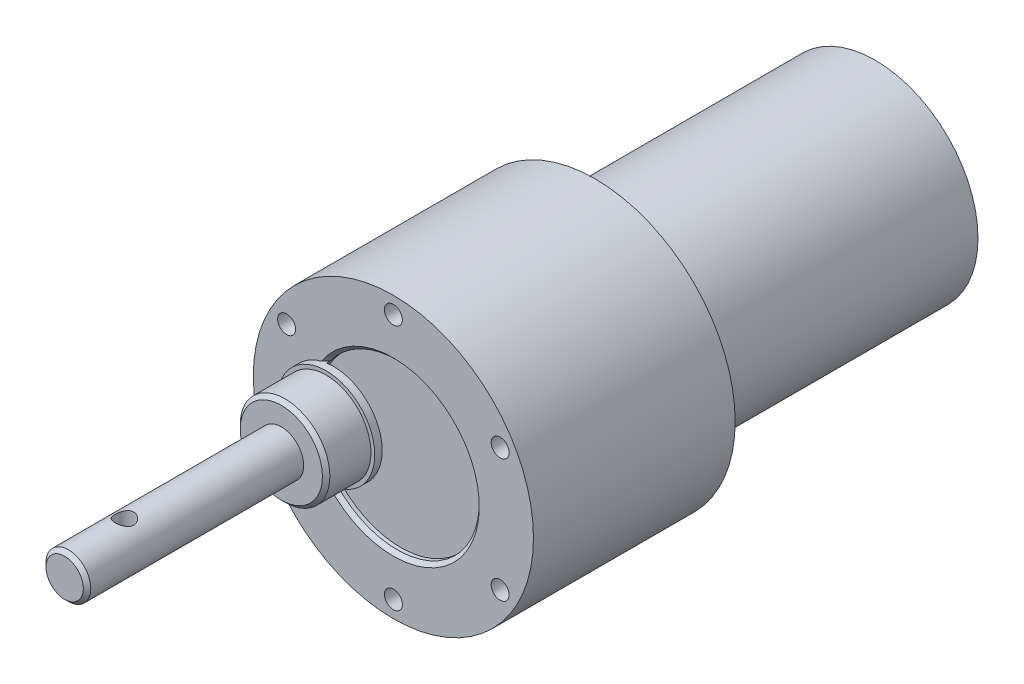
ISO-10303-21;
HEADER;
FILE_DESCRIPTION(('STEP AP214'),'2;1');
FILE_NAME('part.step','',(''),(''),'','','');
FILE_SCHEMA(('AUTOMOTIVE_DESIGN { 1 0 10303 214 1 1 1 1 }'));
ENDSEC;
DATA;
#1=APPLICATION_CONTEXT('core data for automotive mechanical design processes');
#2=APPLICATION_PROTOCOL_DEFINITION('international standard','automotive_design',2000,#1);
#3=PRODUCT_CONTEXT('',#1,'mechanical');
#4=PRODUCT('Part','Part','',(#3));
#5=PRODUCT_RELATED_PRODUCT_CATEGORY('part','',(#4));
#6=PRODUCT_DEFINITION_FORMATION('','',#4);
#7=PRODUCT_DEFINITION_CONTEXT('part definition',#1,'design');
#8=PRODUCT_DEFINITION('design','',#6,#7);
#9=PRODUCT_DEFINITION_SHAPE('','',#8);
#10=(LENGTH_UNIT() NAMED_UNIT(*) SI_UNIT(.MILLI.,.METRE.));
#11=(NAMED_UNIT(*) PLANE_ANGLE_UNIT() SI_UNIT($,.RADIAN.));
#12=(NAMED_UNIT(*) SI_UNIT($,.STERADIAN.) SOLID_ANGLE_UNIT());
#13=UNCERTAINTY_MEASURE_WITH_UNIT(LENGTH_MEASURE(1.E-05),#10,'distance_accuracy_value','');
#14=(GEOMETRIC_REPRESENTATION_CONTEXT(3) GLOBAL_UNCERTAINTY_ASSIGNED_CONTEXT((#13)) GLOBAL_UNIT_ASSIGNED_CONTEXT((#10,
#11,#12)) REPRESENTATION_CONTEXT('',''));
#15=CARTESIAN_POINT('',(0.,0.,0.));
#16=DIRECTION('',(0.,0.,1.));
#17=DIRECTION('',(1.,0.,0.));
#18=AXIS2_PLACEMENT_3D('',#15,#16,#17);
#19=CARTESIAN_POINT('',(0.,0.,64.5));
#20=DIRECTION('',(0.,0.,1.));
#21=DIRECTION('',(1.,0.,0.));
#22=AXIS2_PLACEMENT_3D('',#19,#20,#21);
#23=PLANE('',#22);
#24=CARTESIAN_POINT('',(0.,16.5,64.5));
#25=DIRECTION('',(0.,0.,1.));
#26=DIRECTION('',(1.,0.,0.));
#27=AXIS2_PLACEMENT_3D('',#24,#25,#26);
#28=CIRCLE('',#27,1.19999999999999);
#29=CARTESIAN_POINT('',(1.19999999999999,16.5,64.5));
#30=VERTEX_POINT('',#29);
#31=EDGE_CURVE('E215',#30,#30,#28,.T.);
#32=ORIENTED_EDGE('',*,*,#31,.F.);
#33=EDGE_LOOP('',(#32));
#34=FACE_BOUND('',#33,.T.);
#35=CARTESIAN_POINT('',(-14.28941916244,8.25,64.5));
#36=DIRECTION('',(0.,0.,1.));
#37=DIRECTION('',(1.,0.,0.));
#38=AXIS2_PLACEMENT_3D('',#35,#36,#37);
#39=CIRCLE('',#38,1.19999999999999);
#40=CARTESIAN_POINT('',(-13.08941916244,8.25,64.5));
#41=VERTEX_POINT('',#40);
#42=EDGE_CURVE('E676',#41,#41,#39,.T.);
#43=ORIENTED_EDGE('',*,*,#42,.F.);
#44=EDGE_LOOP('',(#43));
#45=FACE_BOUND('',#44,.T.);
#46=CARTESIAN_POINT('',(-14.28941916244,-8.25,64.5));
#47=DIRECTION('',(0.,0.,1.));
#48=DIRECTION('',(1.,0.,0.));
#49=AXIS2_PLACEMENT_3D('',#46,#47,#48);
#50=CIRCLE('',#49,1.19999999999999);
#51=CARTESIAN_POINT('',(-13.08941916244,-8.25,64.5));
#52=VERTEX_POINT('',#51);
#53=EDGE_CURVE('E670',#52,#52,#50,.T.);
#54=ORIENTED_EDGE('',*,*,#53,.F.);
#55=EDGE_LOOP('',(#54));
#56=FACE_BOUND('',#55,.T.);
#57=CARTESIAN_POINT('',(0.,-16.5,64.5));
#58=DIRECTION('',(0.,0.,1.));
#59=DIRECTION('',(1.,0.,0.));
#60=AXIS2_PLACEMENT_3D('',#57,#58,#59);
#61=CIRCLE('',#60,1.19999999999999);
#62=CARTESIAN_POINT('',(1.19999999999999,-16.5,64.5));
#63=VERTEX_POINT('',#62);
#64=EDGE_CURVE('E664',#63,#63,#61,.T.);
#65=ORIENTED_EDGE('',*,*,#64,.F.);
#66=EDGE_LOOP('',(#65));
#67=FACE_BOUND('',#66,.T.);
#68=CARTESIAN_POINT('',(14.28941916244,-8.25,64.5));
#69=DIRECTION('',(0.,0.,1.));
#70=DIRECTION('',(1.,0.,0.));
#71=AXIS2_PLACEMENT_3D('',#68,#69,#70);
#72=CIRCLE('',#71,1.19999999999999);
#73=CARTESIAN_POINT('',(15.48941916244,-8.25,64.5));
#74=VERTEX_POINT('',#73);
#75=EDGE_CURVE('E658',#74,#74,#72,.T.);
#76=ORIENTED_EDGE('',*,*,#75,.F.);
#77=EDGE_LOOP('',(#76));
#78=FACE_BOUND('',#77,.T.);
#79=CARTESIAN_POINT('',(14.28941916244,8.25,64.5));
#80=DIRECTION('',(0.,0.,1.));
#81=DIRECTION('',(1.,0.,0.));
#82=AXIS2_PLACEMENT_3D('',#79,#80,#81);
#83=CIRCLE('',#82,1.19999999999999);
#84=CARTESIAN_POINT('',(15.48941916244,8.25,64.5));
#85=VERTEX_POINT('',#84);
#86=EDGE_CURVE('E652',#85,#85,#83,.T.);
#87=ORIENTED_EDGE('',*,*,#86,.F.);
#88=EDGE_LOOP('',(#87));
#89=FACE_BOUND('',#88,.T.);
#90=CARTESIAN_POINT('',(-8.,0.,64.5));
#91=DIRECTION('',(0.,0.,1.));
#92=DIRECTION('',(1.,0.,0.));
#93=AXIS2_PLACEMENT_3D('',#90,#91,#92);
#94=CIRCLE('',#93,6.5);
#95=CARTESIAN_POINT('',(-9.62499999999996,6.29359793758706,64.5));
#96=VERTEX_POINT('',#95);
#97=CARTESIAN_POINT('',(-9.62499999999998,-6.29359793758706,64.5));
#98=VERTEX_POINT('',#97);
#99=EDGE_CURVE('E67',#96,#98,#94,.T.);
#100=ORIENTED_EDGE('',*,*,#99,.F.);
#101=CARTESIAN_POINT('',(0.,0.,64.5));
#102=DIRECTION('',(0.,0.,1.));
#103=DIRECTION('',(1.,0.,0.));
#104=AXIS2_PLACEMENT_3D('',#101,#102,#103);
#105=CIRCLE('',#104,11.4999999999999);
#106=EDGE_CURVE('E113',#96,#98,#105,.F.);
#107=ORIENTED_EDGE('',*,*,#106,.T.);
#108=EDGE_LOOP('',(#100,#107));
#109=FACE_BOUND('',#108,.T.);
#110=CARTESIAN_POINT('',(0.,0.,64.5));
#111=DIRECTION('',(0.,0.,1.));
#112=DIRECTION('',(1.,0.,0.));
#113=AXIS2_PLACEMENT_3D('',#110,#111,#112);
#114=CIRCLE('',#113,18.75);
#115=CARTESIAN_POINT('',(18.75,0.,64.5));
#116=VERTEX_POINT('',#115);
#117=EDGE_CURVE('E483',#116,#116,#114,.F.);
#118=ORIENTED_EDGE('',*,*,#117,.F.);
#119=EDGE_LOOP('',(#118));
#120=FACE_BOUND('',#119,.T.);
#121=ADVANCED_FACE('F47',(#34,#45,#56,#67,#78,#89,#109,#120),#23,.T.);
#122=CARTESIAN_POINT('',(0.,0.,63.5));
#123=DIRECTION('',(0.,0.,1.));
#124=DIRECTION('',(1.,0.,0.));
#125=AXIS2_PLACEMENT_3D('',#122,#123,#124);
#126=CYLINDRICAL_SURFACE('',#125,11.);
#127=CARTESIAN_POINT('',(0.,0.,63.5));
#128=DIRECTION('',(0.,0.,1.));
#129=DIRECTION('',(-1.,0.,0.));
#130=AXIS2_PLACEMENT_3D('',#127,#128,#129);
#131=CIRCLE('',#130,11.);
#132=CARTESIAN_POINT('',(-11.,0.,63.5));
#133=VERTEX_POINT('',#132);
#134=EDGE_CURVE('E87',#133,#133,#131,.T.);
#135=ORIENTED_EDGE('',*,*,#134,.F.);
#136=EDGE_LOOP('',(#135));
#137=FACE_BOUND('',#136,.T.);
#138=DIRECTION('',(0.,0.,1.));
#139=VECTOR('',#138,1.);
#140=CARTESIAN_POINT('',(-8.92187500000006,6.43429455996342,64.5));
#141=LINE('',#140,#139);
#142=CARTESIAN_POINT('',(-8.921875,6.43429455996343,64.5));
#143=VERTEX_POINT('',#142);
#144=CARTESIAN_POINT('',(-8.92187500000005,6.43429455996342,64.));
#145=VERTEX_POINT('',#144);
#146=EDGE_CURVE('E91',#143,#145,#141,.F.);
#147=ORIENTED_EDGE('',*,*,#146,.F.);
#148=CARTESIAN_POINT('',(0.,0.,64.5));
#149=DIRECTION('',(0.,0.,1.));
#150=DIRECTION('',(-1.,0.,0.));
#151=AXIS2_PLACEMENT_3D('',#148,#149,#150);
#152=CIRCLE('',#151,11.);
#153=CARTESIAN_POINT('',(-8.921875,-6.43429455996343,64.5));
#154=VERTEX_POINT('',#153);
#155=EDGE_CURVE('E80',#143,#154,#152,.T.);
#156=ORIENTED_EDGE('',*,*,#155,.T.);
#157=DIRECTION('',(0.,0.,1.));
#158=VECTOR('',#157,1.);
#159=CARTESIAN_POINT('',(-8.92187500000006,-6.43429455996342,64.5));
#160=LINE('',#159,#158);
#161=CARTESIAN_POINT('',(-8.921875,-6.43429455996343,63.9999999999999));
#162=VERTEX_POINT('',#161);
#163=EDGE_CURVE('E93',#162,#154,#160,.T.);
#164=ORIENTED_EDGE('',*,*,#163,.F.);
#165=CARTESIAN_POINT('',(0.,0.,64.));
#166=DIRECTION('',(0.,0.,1.));
#167=DIRECTION('',(0.,-1.,0.));
#168=AXIS2_PLACEMENT_3D('',#165,#166,#167);
#169=CIRCLE('',#168,11.);
#170=EDGE_CURVE('E99',#162,#145,#169,.T.);
#171=ORIENTED_EDGE('',*,*,#170,.T.);
#172=EDGE_LOOP('',(#147,#156,#164,#171));
#173=FACE_BOUND('',#172,.T.);
#174=ADVANCED_FACE('F98',(#137,#173),#126,.F.);
#175=CARTESIAN_POINT('',(0.,0.,37.5));
#176=DIRECTION('',(0.,0.,1.));
#177=DIRECTION('',(1.,0.,0.));
#178=AXIS2_PLACEMENT_3D('',#175,#176,#177);
#179=CYLINDRICAL_SURFACE('',#178,18.75);
#180=ORIENTED_EDGE('',*,*,#117,.T.);
#181=EDGE_LOOP('',(#180));
#182=FACE_BOUND('',#181,.T.);
#183=CARTESIAN_POINT('',(0.,0.,37.5));
#184=DIRECTION('',(0.,0.,1.));
#185=DIRECTION('',(1.,0.,0.));
#186=AXIS2_PLACEMENT_3D('',#183,#184,#185);
#187=CIRCLE('',#186,18.75);
#188=CARTESIAN_POINT('',(18.75,0.,37.5));
#189=VERTEX_POINT('',#188);
#190=EDGE_CURVE('E479',#189,#189,#187,.T.);
#191=ORIENTED_EDGE('',*,*,#190,.T.);
#192=EDGE_LOOP('',(#191));
#193=FACE_BOUND('',#192,.T.);
#194=ADVANCED_FACE('F145',(#182,#193),#179,.T.);
#195=CARTESIAN_POINT('',(0.,0.,37.5));
#196=DIRECTION('',(0.,0.,1.));
#197=DIRECTION('',(1.,0.,0.));
#198=AXIS2_PLACEMENT_3D('',#195,#196,#197);
#199=PLANE('',#198);
#200=CARTESIAN_POINT('',(0.,0.,37.5));
#201=DIRECTION('',(0.,0.,1.));
#202=DIRECTION('',(1.,0.,0.));
#203=AXIS2_PLACEMENT_3D('',#200,#201,#202);
#204=CIRCLE('',#203,13.75);
#205=CARTESIAN_POINT('',(13.75,0.,37.5));
#206=VERTEX_POINT('',#205);
#207=EDGE_CURVE('E181',#206,#206,#204,.F.);
#208=ORIENTED_EDGE('',*,*,#207,.F.);
#209=EDGE_LOOP('',(#208));
#210=FACE_BOUND('',#209,.T.);
#211=ORIENTED_EDGE('',*,*,#190,.F.);
#212=EDGE_LOOP('',(#211));
#213=FACE_BOUND('',#212,.T.);
#214=ADVANCED_FACE('F143',(#210,#213),#199,.F.);
#215=CARTESIAN_POINT('',(0.,0.,63.5));
#216=DIRECTION('',(0.,0.,-1.));
#217=DIRECTION('',(-1.,0.,0.));
#218=AXIS2_PLACEMENT_3D('',#215,#216,#217);
#219=PLANE('',#218);
#220=ORIENTED_EDGE('',*,*,#134,.T.);
#221=EDGE_LOOP('',(#220));
#222=FACE_BOUND('',#221,.T.);
#223=ADVANCED_FACE('F134',(#222),#219,.F.);
#224=CARTESIAN_POINT('',(-8.,0.,64.5));
#225=DIRECTION('',(0.,0.,1.));
#226=DIRECTION('',(1.,0.,0.));
#227=AXIS2_PLACEMENT_3D('',#224,#225,#226);
#228=CYLINDRICAL_SURFACE('',#227,6.5);
#229=CARTESIAN_POINT('',(-8.92187500000006,6.43429455996342,64.));
#230=CARTESIAN_POINT('',(-8.95164049411842,6.43002990789093,64.0216476348459));
#231=CARTESIAN_POINT('',(-8.98141654936967,6.42555294531898,64.0432389827954));
#232=CARTESIAN_POINT('',(-9.04084243522193,6.41619415622504,64.0862046482592));
#233=CARTESIAN_POINT('',(-9.07049219209192,6.41131435802628,64.1075795096235));
#234=CARTESIAN_POINT('',(-9.12966018917587,6.40115337928862,64.150112206616));
#235=CARTESIAN_POINT('',(-9.15917838245963,6.39587422332694,64.171270591086));
#236=CARTESIAN_POINT('',(-9.21807802090562,6.38491808439929,64.2133703266013));
#237=CARTESIAN_POINT('',(-9.24745944590181,6.37924312174978,64.2343122315675));
#238=CARTESIAN_POINT('',(-9.30608040637878,6.3674989813667,64.2759790038813));
#239=CARTESIAN_POINT('',(-9.33531994827563,6.36143181924831,64.2967044302395));
#240=CARTESIAN_POINT('',(-9.39365208205739,6.34890695193217,64.337938239308));
#241=CARTESIAN_POINT('',(-9.42274470679677,6.34245125718407,64.3584471861535));
#242=CARTESIAN_POINT('',(-9.48077803639548,6.32915304930846,64.3992480338503));
#243=CARTESIAN_POINT('',(-9.50971880035185,6.32231254102913,64.4195405039685));
#244=CARTESIAN_POINT('',(-9.56744350175877,6.30824849903447,64.4599083828936));
#245=CARTESIAN_POINT('',(-9.59622752447878,6.30102696404836,64.4799843661846));
#246=CARTESIAN_POINT('',(-9.62500000000001,6.29359793758705,64.5));
#247=B_SPLINE_CURVE_WITH_KNOTS('',3,(#229,#230,#231,#232,#233,#234,#235,#236,#237,#238,#239,
#240,#241,#242,#243,#244,#245,#246),.UNSPECIFIED.,.F.,.F.,(4,2,2,2,2,2,2,2,4),(0.,
0.111153021055083,0.221777019902357,0.331873600633093,0.441444390502537,0.550491040304504,
0.659015224751488,0.767018642860324,0.874503018343399),.UNSPECIFIED.);
#248=EDGE_CURVE('E117',#145,#96,#247,.T.);
#249=ORIENTED_EDGE('',*,*,#248,.T.);
#250=ORIENTED_EDGE('',*,*,#99,.T.);
#251=CARTESIAN_POINT('',(-9.62500000000001,-6.29359793758705,64.5));
#252=CARTESIAN_POINT('',(-9.59622752451259,-6.30102696403963,64.4799843662095));
#253=CARTESIAN_POINT('',(-9.56744350182662,-6.30824849901744,64.4599083829433));
#254=CARTESIAN_POINT('',(-9.50971880047823,-6.32231254099883,64.4195405040608));
#255=CARTESIAN_POINT('',(-9.48077803654635,-6.32915304927304,64.3992480339602));
#256=CARTESIAN_POINT('',(-9.422744706987,-6.34245125714133,64.3584471862917));
#257=CARTESIAN_POINT('',(-9.39365208226249,-6.34890695188708,64.3379382394569));
#258=CARTESIAN_POINT('',(-9.33531994850071,-6.36143181920104,64.2967044304026));
#259=CARTESIAN_POINT('',(-9.30608040660899,-6.36749898131946,64.2759790040479));
#260=CARTESIAN_POINT('',(-9.24745944613246,-6.3792431217047,64.2343122317341));
#261=CARTESIAN_POINT('',(-9.21807802113157,-6.38491808435621,64.2133703267643));
#262=CARTESIAN_POINT('',(-9.15917838266629,-6.39587422328955,64.1712705912349));
#263=CARTESIAN_POINT('',(-9.12966018936795,-6.40115337925479,64.1501122067542));
#264=CARTESIAN_POINT('',(-9.07049219224485,-6.41131435800086,64.1075795097334));
#265=CARTESIAN_POINT('',(-9.04084243535031,-6.41619415620433,64.0862046483513));
#266=CARTESIAN_POINT('',(-8.98141654943892,-6.42555294530857,64.0432389828449));
#267=CARTESIAN_POINT('',(-8.95164049415309,-6.43002990788596,64.0216476348707));
#268=CARTESIAN_POINT('',(-8.92187500000006,-6.43429455996342,64.));
#269=B_SPLINE_CURVE_WITH_KNOTS('',3,(#251,#252,#253,#254,#255,#256,#257,#258,#259,#260,#261,
#262,#263,#264,#265,#266,#267,#268),.UNSPECIFIED.,.F.,.F.,(4,2,2,2,2,2,2,2,4),(0.,
0.107484375354398,0.215487793371317,0.324011977763142,0.433058627546721,0.54262941743455,
0.652725998220455,0.763349997159663,0.874503018343449),.UNSPECIFIED.);
#270=EDGE_CURVE('E62',#98,#162,#269,.T.);
#271=ORIENTED_EDGE('',*,*,#270,.T.);
#272=ORIENTED_EDGE('',*,*,#163,.T.);
#273=EDGE_CURVE('E83',#154,#143,#94,.T.);
#274=ORIENTED_EDGE('',*,*,#273,.T.);
#275=ORIENTED_EDGE('',*,*,#146,.T.);
#276=EDGE_LOOP('',(#249,#250,#271,#272,#274,#275));
#277=FACE_BOUND('',#276,.T.);
#278=CARTESIAN_POINT('',(-8.,0.,65.5));
#279=DIRECTION('',(0.,0.,1.));
#280=DIRECTION('',(1.,0.,0.));
#281=AXIS2_PLACEMENT_3D('',#278,#279,#280);
#282=CIRCLE('',#281,6.5);
#283=CARTESIAN_POINT('',(-1.5,0.,65.5));
#284=VERTEX_POINT('',#283);
#285=EDGE_CURVE('E94',#284,#284,#282,.T.);
#286=ORIENTED_EDGE('',*,*,#285,.F.);
#287=EDGE_LOOP('',(#286));
#288=FACE_BOUND('',#287,.T.);
#289=ADVANCED_FACE('F89',(#277,#288),#228,.T.);
#290=CARTESIAN_POINT('',(0.,0.,64.5));
#291=DIRECTION('',(0.,0.,1.));
#292=DIRECTION('',(1.,0.,0.));
#293=AXIS2_PLACEMENT_3D('',#290,#291,#292);
#294=CONICAL_SURFACE('',#293,11.4999999999999,0.785398163397303);
#295=ORIENTED_EDGE('',*,*,#106,.F.);
#296=ORIENTED_EDGE('',*,*,#248,.F.);
#297=ORIENTED_EDGE('',*,*,#170,.F.);
#298=ORIENTED_EDGE('',*,*,#270,.F.);
#299=EDGE_LOOP('',(#295,#296,#297,#298));
#300=FACE_BOUND('',#299,.T.);
#301=ADVANCED_FACE('F133',(#300),#294,.F.);
#302=CARTESIAN_POINT('',(-8.,0.,65.5));
#303=DIRECTION('',(0.,0.,1.));
#304=DIRECTION('',(1.,0.,0.));
#305=AXIS2_PLACEMENT_3D('',#302,#303,#304);
#306=PLANE('',#305);
#307=CARTESIAN_POINT('',(-8.,0.,65.5));
#308=DIRECTION('',(0.,0.,1.));
#309=DIRECTION('',(1.,0.,0.));
#310=AXIS2_PLACEMENT_3D('',#307,#308,#309);
#311=CIRCLE('',#310,6.);
#312=CARTESIAN_POINT('',(-2.,0.,65.5));
#313=VERTEX_POINT('',#312);
#314=EDGE_CURVE('E95',#313,#313,#311,.T.);
#315=ORIENTED_EDGE('',*,*,#314,.F.);
#316=EDGE_LOOP('',(#315));
#317=FACE_BOUND('',#316,.T.);
#318=ORIENTED_EDGE('',*,*,#285,.T.);
#319=EDGE_LOOP('',(#318));
#320=FACE_BOUND('',#319,.T.);
#321=ADVANCED_FACE('F135',(#317,#320),#306,.T.);
#322=CARTESIAN_POINT('',(-8.,0.,64.5));
#323=DIRECTION('',(0.,0.,1.));
#324=DIRECTION('',(1.,0.,0.));
#325=AXIS2_PLACEMENT_3D('',#322,#323,#324);
#326=PLANE('',#325);
#327=ORIENTED_EDGE('',*,*,#155,.F.);
#328=ORIENTED_EDGE('',*,*,#273,.F.);
#329=EDGE_LOOP('',(#327,#328));
#330=FACE_BOUND('',#329,.T.);
#331=ADVANCED_FACE('F82',(#330),#326,.F.);
#332=CARTESIAN_POINT('',(-8.,0.,71.5));
#333=DIRECTION('',(0.,0.,-1.));
#334=DIRECTION('',(-1.,0.,0.));
#335=AXIS2_PLACEMENT_3D('',#332,#333,#334);
#336=CYLINDRICAL_SURFACE('',#335,6.);
#337=CARTESIAN_POINT('',(-8.,0.,70.999999999965));
#338=DIRECTION('',(0.,0.,1.));
#339=DIRECTION('',(1.,0.,0.));
#340=AXIS2_PLACEMENT_3D('',#337,#338,#339);
#341=CIRCLE('',#340,6.);
#342=CARTESIAN_POINT('',(-2.,0.,70.999999999965));
#343=VERTEX_POINT('',#342);
#344=EDGE_CURVE('E172',#343,#343,#341,.F.);
#345=ORIENTED_EDGE('',*,*,#344,.T.);
#346=EDGE_LOOP('',(#345));
#347=FACE_BOUND('',#346,.T.);
#348=ORIENTED_EDGE('',*,*,#314,.T.);
#349=EDGE_LOOP('',(#348));
#350=FACE_BOUND('',#349,.T.);
#351=ADVANCED_FACE('F297',(#347,#350),#336,.T.);
#352=CARTESIAN_POINT('',(-8.,0.,71.5));
#353=DIRECTION('',(0.,0.,1.));
#354=DIRECTION('',(1.,0.,0.));
#355=AXIS2_PLACEMENT_3D('',#352,#353,#354);
#356=PLANE('',#355);
#357=CARTESIAN_POINT('',(-8.,0.,71.5));
#358=DIRECTION('',(0.,0.,1.));
#359=DIRECTION('',(1.,0.,0.));
#360=AXIS2_PLACEMENT_3D('',#357,#358,#359);
#361=CIRCLE('',#360,5.49999999996499);
#362=CARTESIAN_POINT('',(-2.50000000003501,0.,71.5));
#363=VERTEX_POINT('',#362);
#364=EDGE_CURVE('E175',#363,#363,#361,.T.);
#365=ORIENTED_EDGE('',*,*,#364,.T.);
#366=EDGE_LOOP('',(#365));
#367=FACE_BOUND('',#366,.T.);
#368=CARTESIAN_POINT('',(-8.,0.,71.5));
#369=DIRECTION('',(0.,0.,1.));
#370=DIRECTION('',(1.,0.,0.));
#371=AXIS2_PLACEMENT_3D('',#368,#369,#370);
#372=CIRCLE('',#371,3.);
#373=CARTESIAN_POINT('',(-5.,0.,71.5));
#374=VERTEX_POINT('',#373);
#375=EDGE_CURVE('E285',#374,#374,#372,.T.);
#376=ORIENTED_EDGE('',*,*,#375,.F.);
#377=EDGE_LOOP('',(#376));
#378=FACE_BOUND('',#377,.T.);
#379=ADVANCED_FACE('F203',(#367,#378),#356,.T.);
#380=CARTESIAN_POINT('',(-8.,0.,100.5));
#381=DIRECTION('',(0.,0.,-1.));
#382=DIRECTION('',(-1.,0.,0.));
#383=AXIS2_PLACEMENT_3D('',#380,#381,#382);
#384=CYLINDRICAL_SURFACE('',#383,3.);
#385=CARTESIAN_POINT('',(-8.,0.,99.999999999965));
#386=DIRECTION('',(0.,0.,1.));
#387=DIRECTION('',(1.,0.,0.));
#388=AXIS2_PLACEMENT_3D('',#385,#386,#387);
#389=CIRCLE('',#388,3.);
#390=CARTESIAN_POINT('',(-5.,0.,99.999999999965));
#391=VERTEX_POINT('',#390);
#392=EDGE_CURVE('E13',#391,#391,#389,.F.);
#393=ORIENTED_EDGE('',*,*,#392,.T.);
#394=EDGE_LOOP('',(#393));
#395=FACE_BOUND('',#394,.T.);
#396=CARTESIAN_POINT('',(-8.,3.,93.75));
#397=CARTESIAN_POINT('',(-8.06695805263627,2.99999458367273,93.7499927949087));
#398=CARTESIAN_POINT('',(-8.13402139706384,2.9977323297471,93.7445880414718));
#399=CARTESIAN_POINT('',(-8.26624737115634,2.98890153579552,93.7231609350798));
#400=CARTESIAN_POINT('',(-8.33140457642356,2.98232175901028,93.7071108755357));
#401=CARTESIAN_POINT('',(-8.45768873365308,2.96556289038127,93.6650889082194));
#402=CARTESIAN_POINT('',(-8.51882852442626,2.95539599975004,93.6391506105318));
#403=CARTESIAN_POINT('',(-8.63582975667979,2.93245286470664,93.5782271767674));
#404=CARTESIAN_POINT('',(-8.69169279001593,2.91967741092849,93.5432447810291));
#405=CARTESIAN_POINT('',(-8.79944840355951,2.89207828351869,93.4633710174091));
#406=CARTESIAN_POINT('',(-8.85104126751776,2.87718753326093,93.4180986912102));
#407=CARTESIAN_POINT('',(-8.94615982109125,2.84732714068514,93.3197356652174));
#408=CARTESIAN_POINT('',(-8.98968126315308,2.8323574610681,93.2666408751055));
#409=CARTESIAN_POINT('',(-9.06953737697065,2.80321021812995,93.1509732224351));
#410=CARTESIAN_POINT('',(-9.10541308153924,2.78910786873385,93.0880625515735));
#411=CARTESIAN_POINT('',(-9.16593940588865,2.76435572357005,92.9564267420791));
#412=CARTESIAN_POINT('',(-9.1905958083629,2.75370415000824,92.8877046205155));
#413=CARTESIAN_POINT('',(-9.22674598312158,2.73778555387705,92.7498463082321));
#414=CARTESIAN_POINT('',(-9.23881657877605,2.73228387651787,92.6808895166078));
#415=CARTESIAN_POINT('',(-9.25125209967795,2.72661326219504,92.5417267073134));
#416=CARTESIAN_POINT('',(-9.25162348054396,2.7264413842526,92.4715213999743));
#417=CARTESIAN_POINT('',(-9.24108450363673,2.73125119560853,92.3375999395651));
#418=CARTESIAN_POINT('',(-9.231036811123,2.73583882723623,92.2737989034355));
#419=CARTESIAN_POINT('',(-9.20139191015775,2.74898482773797,92.1488879089996));
#420=CARTESIAN_POINT('',(-9.18179287287176,2.75754395703564,92.0877784685082));
#421=CARTESIAN_POINT('',(-9.1332195872757,2.77786184772757,91.9684422970086));
#422=CARTESIAN_POINT('',(-9.10405471539234,2.78968481949137,91.9103045790866));
#423=CARTESIAN_POINT('',(-9.03731242580561,2.81518331141086,91.7995222661199));
#424=CARTESIAN_POINT('',(-8.99973169051954,2.8288595612978,91.7468798493865));
#425=CARTESIAN_POINT('',(-8.91349596554383,2.85792976877979,91.6439000412672));
#426=CARTESIAN_POINT('',(-8.86417348320753,2.87337121404473,91.5941334326146));
#427=CARTESIAN_POINT('',(-8.75772959105151,2.90325673112529,91.5033864970408));
#428=CARTESIAN_POINT('',(-8.70060635944846,2.9177005687701,91.4624082283078));
#429=CARTESIAN_POINT('',(-8.57844794869338,2.94438283556473,91.3895641763837));
#430=CARTESIAN_POINT('',(-8.51326058244768,2.95656266543334,91.3579305548493));
#431=CARTESIAN_POINT('',(-8.37785240252683,2.97689481414803,91.3062788603967));
#432=CARTESIAN_POINT('',(-8.30763439479503,2.985049358458,91.2862543680562));
#433=CARTESIAN_POINT('',(-8.16892811334623,2.99599641186385,91.2595840078734));
#434=CARTESIAN_POINT('',(-8.10061128527864,2.99909541047125,91.2521721425563));
#435=CARTESIAN_POINT('',(-7.96364534450391,3.00056050368745,91.2486537763859));
#436=CARTESIAN_POINT('',(-7.89499633284737,2.99892795711939,91.252544029748));
#437=CARTESIAN_POINT('',(-7.76290175765857,2.9913121765694,91.2709710848061));
#438=CARTESIAN_POINT('',(-7.69936703336062,2.9855488728399,91.2849699540972));
#439=CARTESIAN_POINT('',(-7.57561725102891,2.97048606772414,91.3224681945408));
#440=CARTESIAN_POINT('',(-7.51540261348164,2.96118611959704,91.3459687659503));
#441=CARTESIAN_POINT('',(-7.39789100013087,2.93958270645166,91.4025709757121));
#442=CARTESIAN_POINT('',(-7.34074276314468,2.92719491469281,91.4359481831461));
#443=CARTESIAN_POINT('',(-7.23265378376858,2.9007380457909,91.5110533777917));
#444=CARTESIAN_POINT('',(-7.18171564739807,2.88666826768733,91.5527848515293));
#445=CARTESIAN_POINT('',(-7.08366656972574,2.85712087895438,91.6469032332724));
#446=CARTESIAN_POINT('',(-7.03708930202017,2.84161451591029,91.6998385029863));
#447=CARTESIAN_POINT('',(-6.9533301538945,2.81184336768006,91.8130212759354));
#448=CARTESIAN_POINT('',(-6.91615040714384,2.79757886493439,91.8732704351717));
#449=CARTESIAN_POINT('',(-6.85184039791302,2.77181386243989,92.0006141753026));
#450=CARTESIAN_POINT('',(-6.82486081762673,2.76035562555112,92.0677940355148));
#451=CARTESIAN_POINT('',(-6.78282586048429,2.74208355658958,92.2063705938101));
#452=CARTESIAN_POINT('',(-6.76776065136314,2.73526589555753,92.2777637624833));
#453=CARTESIAN_POINT('',(-6.75095919651101,2.72763164537264,92.4168186991992));
#454=CARTESIAN_POINT('',(-6.74828619586872,2.72639350967163,92.4843446622926));
#455=CARTESIAN_POINT('',(-6.75384424476089,2.72893853011024,92.6188428611411));
#456=CARTESIAN_POINT('',(-6.7620736203528,2.73272091540307,92.6858151803137));
#457=CARTESIAN_POINT('',(-6.7884159521951,2.74449551302268,92.8140927474689));
#458=CARTESIAN_POINT('',(-6.80605096428535,2.75228354846481,92.8755166734634));
#459=CARTESIAN_POINT('',(-6.85023671797867,2.77103181199189,92.9945480213572));
#460=CARTESIAN_POINT('',(-6.87678996482749,2.78199293131694,93.0521543653988));
#461=CARTESIAN_POINT('',(-6.93989714064512,2.80666954560013,93.1656958959491));
#462=CARTESIAN_POINT('',(-6.97695639089518,2.8205110271368,93.2213223301683));
#463=CARTESIAN_POINT('',(-7.05931592736961,2.84903689053839,93.3258601393607));
#464=CARTESIAN_POINT('',(-7.10461907109439,2.86372156345875,93.3747691756006));
#465=CARTESIAN_POINT('',(-7.20609795422119,2.89356392850106,93.4681486816847));
#466=CARTESIAN_POINT('',(-7.26282526005098,2.90867817511792,93.5120364328406));
#467=CARTESIAN_POINT('',(-7.38339992074681,2.9366014362202,93.5896994535436));
#468=CARTESIAN_POINT('',(-7.44725050205427,2.94940939916741,93.6234701148895));
#469=CARTESIAN_POINT('',(-7.57926794328207,2.97109183362461,93.6792098454399));
#470=CARTESIAN_POINT('',(-7.64734600901938,2.98002782581964,93.7013647666173));
#471=CARTESIAN_POINT('',(-7.78658957815345,2.99321009768625,93.7337063290778));
#472=CARTESIAN_POINT('',(-7.85774468301905,2.99747105811967,93.7439304425299));
#473=CARTESIAN_POINT('',(-7.95276391808082,2.99972287568934,93.7493331610864));
#474=CARTESIAN_POINT('',(-7.97637540532434,3.00000191102536,93.7500025421492));
#475=CARTESIAN_POINT('',(-8.,3.,93.75));
#476=B_SPLINE_CURVE_WITH_KNOTS('',3,(#396,#397,#398,#399,#400,#401,#402,#403,#404,#405,#406,
#407,#408,#409,#410,#411,#412,#413,#414,#415,#416,#417,#418,#419,#420,#421,#422,#423,#424,#425,
#426,#427,#428,#429,#430,#431,#432,#433,#434,#435,#436,#437,#438,#439,#440,#441,#442,#443,#444,
#445,#446,#447,#448,#449,#450,#451,#452,#453,#454,#455,#456,#457,#458,#459,#460,#461,#462,#463,
#464,#465,#466,#467,#468,#469,#470,#471,#472,#473,#474,#475),.UNSPECIFIED.,.T.,.F.,(4,2,2,2,2,2,
2,2,2,2,2,2,2,2,2,2,2,2,2,2,2,2,2,2,2,2,2,2,2,2,2,2,2,2,2,2,2,2,2,4),(0.,0.200806918883934,
0.40213854062869,0.602791851906289,0.803384436852963,1.01317936288805,1.22308438131465,
1.44331724539124,1.66343646730587,1.87295273137558,2.08235338249043,2.27570157202554,
2.46908679727211,2.66658713058713,2.86416545717202,3.07844141127892,3.29276749314584,
3.5120405506081,3.73119224218293,3.93648443393247,4.14171767493168,4.33676589735717,
4.53183876601781,4.73297135272157,4.93418805469491,5.14978488029289,5.36543061240336,
5.58414788359518,5.80268447074574,6.00439877559636,6.20608211297531,6.39837649964756,
6.59072494950606,6.79463893397434,6.99862373425937,7.21746535004882,7.43640649428576,
7.65172855819379,7.86637250469314,7.9372225649909),.UNSPECIFIED.);
#477=CARTESIAN_POINT('',(-8.,3.,93.75));
#478=VERTEX_POINT('',#477);
#479=EDGE_CURVE('E177',#478,#478,#476,.T.);
#480=ORIENTED_EDGE('',*,*,#479,.T.);
#481=EDGE_LOOP('',(#480));
#482=FACE_BOUND('',#481,.T.);
#483=CARTESIAN_POINT('',(-8.,-3.,93.75));
#484=CARTESIAN_POINT('',(-7.93304194736373,-2.99999458367273,93.7499927949087));
#485=CARTESIAN_POINT('',(-7.86597860293616,-2.9977323297471,93.7445880414718));
#486=CARTESIAN_POINT('',(-7.73375262884366,-2.98890153579552,93.7231609350798));
#487=CARTESIAN_POINT('',(-7.66859542357644,-2.98232175901028,93.7071108755357));
#488=CARTESIAN_POINT('',(-7.54231126634691,-2.96556289038127,93.6650889082194));
#489=CARTESIAN_POINT('',(-7.48117147557373,-2.95539599975004,93.6391506105318));
#490=CARTESIAN_POINT('',(-7.3641702433202,-2.93245286470664,93.5782271767674));
#491=CARTESIAN_POINT('',(-7.30830720998406,-2.91967741092849,93.5432447810291));
#492=CARTESIAN_POINT('',(-7.20055159644049,-2.89207828351869,93.4633710174091));
#493=CARTESIAN_POINT('',(-7.14895873248223,-2.87718753326093,93.4180986912102));
#494=CARTESIAN_POINT('',(-7.05384017890873,-2.84732714068513,93.3197356652174));
#495=CARTESIAN_POINT('',(-7.01031873684692,-2.83235746106809,93.2666408751055));
#496=CARTESIAN_POINT('',(-6.93046262302935,-2.80321021812995,93.1509732224351));
#497=CARTESIAN_POINT('',(-6.89458691846076,-2.78910786873385,93.0880625515735));
#498=CARTESIAN_POINT('',(-6.83406059411135,-2.76435572357005,92.9564267420791));
#499=CARTESIAN_POINT('',(-6.8094041916371,-2.75370415000824,92.8877046205155));
#500=CARTESIAN_POINT('',(-6.77325401687842,-2.73778555387705,92.7498463082321));
#501=CARTESIAN_POINT('',(-6.76118342122395,-2.73228387651787,92.6808895166078));
#502=CARTESIAN_POINT('',(-6.74874790032205,-2.72661326219504,92.5417267073134));
#503=CARTESIAN_POINT('',(-6.74837651945604,-2.7264413842526,92.4715213999743));
#504=CARTESIAN_POINT('',(-6.75891549636327,-2.73125119560853,92.3375999395651));
#505=CARTESIAN_POINT('',(-6.768963188877,-2.73583882723623,92.2737989034355));
#506=CARTESIAN_POINT('',(-6.79860808984225,-2.74898482773797,92.1488879089996));
#507=CARTESIAN_POINT('',(-6.81820712712824,-2.75754395703564,92.0877784685082));
#508=CARTESIAN_POINT('',(-6.86678041272431,-2.77786184772757,91.9684422970086));
#509=CARTESIAN_POINT('',(-6.89594528460765,-2.78968481949137,91.9103045790866));
#510=CARTESIAN_POINT('',(-6.96268757419439,-2.81518331141086,91.7995222661199));
#511=CARTESIAN_POINT('',(-7.00026830948046,-2.8288595612978,91.7468798493865));
#512=CARTESIAN_POINT('',(-7.08650403445617,-2.85792976877979,91.6439000412672));
#513=CARTESIAN_POINT('',(-7.13582651679247,-2.87337121404473,91.5941334326146));
#514=CARTESIAN_POINT('',(-7.24227040894849,-2.90325673112529,91.5033864970408));
#515=CARTESIAN_POINT('',(-7.29939364055154,-2.9177005687701,91.4624082283078));
#516=CARTESIAN_POINT('',(-7.42155205130662,-2.94438283556473,91.3895641763837));
#517=CARTESIAN_POINT('',(-7.48673941755232,-2.95656266543334,91.3579305548493));
#518=CARTESIAN_POINT('',(-7.62214759747317,-2.97689481414803,91.3062788603967));
#519=CARTESIAN_POINT('',(-7.69236560520497,-2.985049358458,91.2862543680562));
#520=CARTESIAN_POINT('',(-7.83107188665377,-2.99599641186385,91.2595840078734));
#521=CARTESIAN_POINT('',(-7.89938871472136,-2.99909541047125,91.2521721425563));
#522=CARTESIAN_POINT('',(-8.03635465549609,-3.00056050368745,91.2486537763859));
#523=CARTESIAN_POINT('',(-8.10500366715264,-2.99892795711939,91.252544029748));
#524=CARTESIAN_POINT('',(-8.23709824234143,-2.9913121765694,91.2709710848061));
#525=CARTESIAN_POINT('',(-8.30063296663938,-2.9855488728399,91.2849699540972));
#526=CARTESIAN_POINT('',(-8.42438274897109,-2.97048606772414,91.3224681945408));
#527=CARTESIAN_POINT('',(-8.48459738651836,-2.96118611959704,91.3459687659503));
#528=CARTESIAN_POINT('',(-8.60210899986913,-2.93958270645166,91.4025709757121));
#529=CARTESIAN_POINT('',(-8.65925723685532,-2.92719491469281,91.4359481831461));
#530=CARTESIAN_POINT('',(-8.76734621623143,-2.9007380457909,91.5110533777917));
#531=CARTESIAN_POINT('',(-8.81828435260194,-2.88666826768733,91.5527848515293));
#532=CARTESIAN_POINT('',(-8.91633343027426,-2.85712087895438,91.6469032332724));
#533=CARTESIAN_POINT('',(-8.96291069797983,-2.84161451591029,91.6998385029863));
#534=CARTESIAN_POINT('',(-9.0466698461055,-2.81184336768006,91.8130212759354));
#535=CARTESIAN_POINT('',(-9.08384959285616,-2.79757886493439,91.8732704351717));
#536=CARTESIAN_POINT('',(-9.14815960208698,-2.77181386243989,92.0006141753026));
#537=CARTESIAN_POINT('',(-9.17513918237328,-2.76035562555112,92.0677940355148));
#538=CARTESIAN_POINT('',(-9.21717413951572,-2.74208355658958,92.2063705938101));
#539=CARTESIAN_POINT('',(-9.23223934863686,-2.73526589555753,92.2777637624833));
#540=CARTESIAN_POINT('',(-9.24904080348899,-2.72763164537265,92.4168186991992));
#541=CARTESIAN_POINT('',(-9.25171380413128,-2.72639350967163,92.4843446622926));
#542=CARTESIAN_POINT('',(-9.24615575523911,-2.72893853011024,92.6188428611411));
#543=CARTESIAN_POINT('',(-9.2379263796472,-2.73272091540307,92.6858151803137));
#544=CARTESIAN_POINT('',(-9.2115840478049,-2.74449551302268,92.8140927474689));
#545=CARTESIAN_POINT('',(-9.19394903571465,-2.75228354846481,92.8755166734634));
#546=CARTESIAN_POINT('',(-9.14976328202134,-2.77103181199189,92.9945480213572));
#547=CARTESIAN_POINT('',(-9.12321003517251,-2.78199293131694,93.0521543653988));
#548=CARTESIAN_POINT('',(-9.06010285935488,-2.80666954560014,93.1656958959491));
#549=CARTESIAN_POINT('',(-9.02304360910482,-2.8205110271368,93.2213223301683));
#550=CARTESIAN_POINT('',(-8.94068407263038,-2.8490368905384,93.3258601393607));
#551=CARTESIAN_POINT('',(-8.89538092890561,-2.86372156345875,93.3747691756006));
#552=CARTESIAN_POINT('',(-8.79390204577881,-2.89356392850106,93.4681486816847));
#553=CARTESIAN_POINT('',(-8.73717473994902,-2.90867817511792,93.5120364328406));
#554=CARTESIAN_POINT('',(-8.61660007925319,-2.9366014362202,93.5896994535436));
#555=CARTESIAN_POINT('',(-8.55274949794573,-2.94940939916741,93.6234701148895));
#556=CARTESIAN_POINT('',(-8.42073205671793,-2.97109183362461,93.6792098454399));
#557=CARTESIAN_POINT('',(-8.35265399098062,-2.98002782581964,93.7013647666173));
#558=CARTESIAN_POINT('',(-8.21341042184655,-2.99321009768625,93.7337063290778));
#559=CARTESIAN_POINT('',(-8.14225531698095,-2.99747105811967,93.7439304425299));
#560=CARTESIAN_POINT('',(-8.04723608191918,-2.99972287568934,93.7493331610864));
#561=CARTESIAN_POINT('',(-8.02362459467565,-3.00000191102536,93.7500025421492));
#562=CARTESIAN_POINT('',(-8.,-3.,93.75));
#563=B_SPLINE_CURVE_WITH_KNOTS('',3,(#483,#484,#485,#486,#487,#488,#489,#490,#491,#492,#493,
#494,#495,#496,#497,#498,#499,#500,#501,#502,#503,#504,#505,#506,#507,#508,#509,#510,#511,#512,
#513,#514,#515,#516,#517,#518,#519,#520,#521,#522,#523,#524,#525,#526,#527,#528,#529,#530,#531,
#532,#533,#534,#535,#536,#537,#538,#539,#540,#541,#542,#543,#544,#545,#546,#547,#548,#549,#550,
#551,#552,#553,#554,#555,#556,#557,#558,#559,#560,#561,#562),.UNSPECIFIED.,.T.,.F.,(4,2,2,2,2,2,
2,2,2,2,2,2,2,2,2,2,2,2,2,2,2,2,2,2,2,2,2,2,2,2,2,2,2,2,2,2,2,2,2,4),(0.,0.200806918883936,
0.402138540628691,0.602791851906301,0.803384436852972,1.01317936288809,1.22308438131465,
1.44331724539124,1.66343646730587,1.87295273137558,2.08235338249043,2.27570157202554,
2.46908679727211,2.66658713058713,2.86416545717202,3.07844141127892,3.29276749314584,
3.5120405506081,3.73119224218294,3.93648443393247,4.14171767493168,4.33676589735717,
4.53183876601781,4.73297135272158,4.93418805469491,5.14978488029289,5.36543061240336,
5.58414788359517,5.80268447074574,6.00439877559636,6.20608211297531,6.39837649964755,
6.59072494950606,6.79463893397436,6.99862373425937,7.21746535004882,7.43640649428576,
7.65172855819379,7.86637250469314,7.9372225649909),.UNSPECIFIED.);
#564=CARTESIAN_POINT('',(-8.,-3.,93.75));
#565=VERTEX_POINT('',#564);
#566=EDGE_CURVE('E210',#565,#565,#563,.T.);
#567=ORIENTED_EDGE('',*,*,#566,.T.);
#568=EDGE_LOOP('',(#567));
#569=FACE_BOUND('',#568,.T.);
#570=ORIENTED_EDGE('',*,*,#375,.T.);
#571=EDGE_LOOP('',(#570));
#572=FACE_BOUND('',#571,.T.);
#573=ADVANCED_FACE('F194',(#395,#482,#569,#572),#384,.T.);
#574=CARTESIAN_POINT('',(-8.,0.,100.5));
#575=DIRECTION('',(0.,0.,1.));
#576=DIRECTION('',(1.,0.,0.));
#577=AXIS2_PLACEMENT_3D('',#574,#575,#576);
#578=PLANE('',#577);
#579=CARTESIAN_POINT('',(-8.,0.,100.5));
#580=DIRECTION('',(0.,0.,1.));
#581=DIRECTION('',(1.,0.,0.));
#582=AXIS2_PLACEMENT_3D('',#579,#580,#581);
#583=CIRCLE('',#582,2.49999999996499);
#584=CARTESIAN_POINT('',(-5.50000000003501,0.,100.5));
#585=VERTEX_POINT('',#584);
#586=EDGE_CURVE('E55',#585,#585,#583,.T.);
#587=ORIENTED_EDGE('',*,*,#586,.T.);
#588=EDGE_LOOP('',(#587));
#589=FACE_BOUND('',#588,.T.);
#590=ADVANCED_FACE('F190',(#589),#578,.T.);
#591=CARTESIAN_POINT('',(0.,0.,0.));
#592=DIRECTION('',(0.,0.,1.));
#593=DIRECTION('',(1.,0.,0.));
#594=AXIS2_PLACEMENT_3D('',#591,#592,#593);
#595=CYLINDRICAL_SURFACE('',#594,13.75);
#596=CARTESIAN_POINT('',(0.,0.,0.));
#597=DIRECTION('',(0.,0.,-1.));
#598=DIRECTION('',(-1.,0.,0.));
#599=AXIS2_PLACEMENT_3D('',#596,#597,#598);
#600=CIRCLE('',#599,13.75);
#601=CARTESIAN_POINT('',(-13.75,0.,0.));
#602=VERTEX_POINT('',#601);
#603=EDGE_CURVE('E284',#602,#602,#600,.T.);
#604=ORIENTED_EDGE('',*,*,#603,.F.);
#605=EDGE_LOOP('',(#604));
#606=FACE_BOUND('',#605,.T.);
#607=ORIENTED_EDGE('',*,*,#207,.T.);
#608=EDGE_LOOP('',(#607));
#609=FACE_BOUND('',#608,.T.);
#610=ADVANCED_FACE('F193',(#606,#609),#595,.T.);
#611=CARTESIAN_POINT('',(0.,0.,0.));
#612=DIRECTION('',(0.,0.,-1.));
#613=DIRECTION('',(-1.,0.,0.));
#614=AXIS2_PLACEMENT_3D('',#611,#612,#613);
#615=PLANE('',#614);
#616=CARTESIAN_POINT('',(0.,0.,0.));
#617=DIRECTION('',(0.,0.,-1.));
#618=DIRECTION('',(-1.,0.,0.));
#619=AXIS2_PLACEMENT_3D('',#616,#617,#618);
#620=CIRCLE('',#619,4.);
#621=CARTESIAN_POINT('',(-4.,0.,0.));
#622=VERTEX_POINT('',#621);
#623=EDGE_CURVE('E281',#622,#622,#620,.T.);
#624=ORIENTED_EDGE('',*,*,#623,.F.);
#625=EDGE_LOOP('',(#624));
#626=FACE_BOUND('',#625,.T.);
#627=ORIENTED_EDGE('',*,*,#603,.T.);
#628=EDGE_LOOP('',(#627));
#629=FACE_BOUND('',#628,.T.);
#630=ADVANCED_FACE('F200',(#626,#629),#615,.T.);
#631=CARTESIAN_POINT('',(0.,0.,-2.5));
#632=DIRECTION('',(0.,0.,1.));
#633=DIRECTION('',(1.,0.,0.));
#634=AXIS2_PLACEMENT_3D('',#631,#632,#633);
#635=CYLINDRICAL_SURFACE('',#634,4.);
#636=CARTESIAN_POINT('',(0.,0.,-2.5));
#637=DIRECTION('',(0.,0.,-1.));
#638=DIRECTION('',(-1.,0.,0.));
#639=AXIS2_PLACEMENT_3D('',#636,#637,#638);
#640=CIRCLE('',#639,4.);
#641=CARTESIAN_POINT('',(-4.,0.,-2.5));
#642=VERTEX_POINT('',#641);
#643=EDGE_CURVE('E286',#642,#642,#640,.T.);
#644=ORIENTED_EDGE('',*,*,#643,.F.);
#645=EDGE_LOOP('',(#644));
#646=FACE_BOUND('',#645,.T.);
#647=ORIENTED_EDGE('',*,*,#623,.T.);
#648=EDGE_LOOP('',(#647));
#649=FACE_BOUND('',#648,.T.);
#650=ADVANCED_FACE('F270',(#646,#649),#635,.T.);
#651=CARTESIAN_POINT('',(0.,0.,-2.5));
#652=DIRECTION('',(0.,0.,-1.));
#653=DIRECTION('',(-1.,0.,0.));
#654=AXIS2_PLACEMENT_3D('',#651,#652,#653);
#655=PLANE('',#654);
#656=ORIENTED_EDGE('',*,*,#643,.T.);
#657=EDGE_LOOP('',(#656));
#658=FACE_BOUND('',#657,.T.);
#659=ADVANCED_FACE('F266',(#658),#655,.T.);
#660=CARTESIAN_POINT('',(14.28941916244,8.25,59.5));
#661=DIRECTION('',(0.,0.,-1.));
#662=DIRECTION('',(-1.,0.,0.));
#663=AXIS2_PLACEMENT_3D('',#660,#661,#662);
#664=PLANE('',#663);
#665=CARTESIAN_POINT('',(14.28941916244,8.25,59.5));
#666=DIRECTION('',(0.,0.,1.));
#667=DIRECTION('',(1.,0.,0.));
#668=AXIS2_PLACEMENT_3D('',#665,#666,#667);
#669=CIRCLE('',#668,1.19999999999999);
#670=CARTESIAN_POINT('',(15.48941916244,8.25,59.5));
#671=VERTEX_POINT('',#670);
#672=EDGE_CURVE('E648',#671,#671,#669,.T.);
#673=ORIENTED_EDGE('',*,*,#672,.T.);
#674=EDGE_LOOP('',(#673));
#675=FACE_BOUND('',#674,.T.);
#676=ADVANCED_FACE('F262',(#675),#664,.F.);
#677=CARTESIAN_POINT('',(14.28941916244,8.25,64.5));
#678=DIRECTION('',(0.,0.,1.));
#679=DIRECTION('',(1.,0.,0.));
#680=AXIS2_PLACEMENT_3D('',#677,#678,#679);
#681=CYLINDRICAL_SURFACE('',#680,1.19999999999999);
#682=ORIENTED_EDGE('',*,*,#672,.F.);
#683=EDGE_LOOP('',(#682));
#684=FACE_BOUND('',#683,.T.);
#685=ORIENTED_EDGE('',*,*,#86,.T.);
#686=EDGE_LOOP('',(#685));
#687=FACE_BOUND('',#686,.T.);
#688=ADVANCED_FACE('F258',(#684,#687),#681,.F.);
#689=CARTESIAN_POINT('',(14.28941916244,-8.25,59.5));
#690=DIRECTION('',(0.,0.,-1.));
#691=DIRECTION('',(-1.,0.,0.));
#692=AXIS2_PLACEMENT_3D('',#689,#690,#691);
#693=PLANE('',#692);
#694=CARTESIAN_POINT('',(14.28941916244,-8.25,59.5));
#695=DIRECTION('',(0.,0.,1.));
#696=DIRECTION('',(1.,0.,0.));
#697=AXIS2_PLACEMENT_3D('',#694,#695,#696);
#698=CIRCLE('',#697,1.19999999999999);
#699=CARTESIAN_POINT('',(15.48941916244,-8.25,59.5));
#700=VERTEX_POINT('',#699);
#701=EDGE_CURVE('E655',#700,#700,#698,.T.);
#702=ORIENTED_EDGE('',*,*,#701,.T.);
#703=EDGE_LOOP('',(#702));
#704=FACE_BOUND('',#703,.T.);
#705=ADVANCED_FACE('F254',(#704),#693,.F.);
#706=CARTESIAN_POINT('',(14.28941916244,-8.25,64.5));
#707=DIRECTION('',(0.,0.,1.));
#708=DIRECTION('',(1.,0.,0.));
#709=AXIS2_PLACEMENT_3D('',#706,#707,#708);
#710=CYLINDRICAL_SURFACE('',#709,1.19999999999999);
#711=ORIENTED_EDGE('',*,*,#701,.F.);
#712=EDGE_LOOP('',(#711));
#713=FACE_BOUND('',#712,.T.);
#714=ORIENTED_EDGE('',*,*,#75,.T.);
#715=EDGE_LOOP('',(#714));
#716=FACE_BOUND('',#715,.T.);
#717=ADVANCED_FACE('F250',(#713,#716),#710,.F.);
#718=CARTESIAN_POINT('',(0.,-16.5,59.5));
#719=DIRECTION('',(0.,0.,-1.));
#720=DIRECTION('',(-1.,0.,0.));
#721=AXIS2_PLACEMENT_3D('',#718,#719,#720);
#722=PLANE('',#721);
#723=CARTESIAN_POINT('',(0.,-16.5,59.5));
#724=DIRECTION('',(0.,0.,1.));
#725=DIRECTION('',(1.,0.,0.));
#726=AXIS2_PLACEMENT_3D('',#723,#724,#725);
#727=CIRCLE('',#726,1.19999999999999);
#728=CARTESIAN_POINT('',(1.19999999999999,-16.5,59.5));
#729=VERTEX_POINT('',#728);
#730=EDGE_CURVE('E661',#729,#729,#727,.T.);
#731=ORIENTED_EDGE('',*,*,#730,.T.);
#732=EDGE_LOOP('',(#731));
#733=FACE_BOUND('',#732,.T.);
#734=ADVANCED_FACE('F246',(#733),#722,.F.);
#735=CARTESIAN_POINT('',(0.,-16.5,64.5));
#736=DIRECTION('',(0.,0.,1.));
#737=DIRECTION('',(1.,0.,0.));
#738=AXIS2_PLACEMENT_3D('',#735,#736,#737);
#739=CYLINDRICAL_SURFACE('',#738,1.19999999999999);
#740=ORIENTED_EDGE('',*,*,#730,.F.);
#741=EDGE_LOOP('',(#740));
#742=FACE_BOUND('',#741,.T.);
#743=ORIENTED_EDGE('',*,*,#64,.T.);
#744=EDGE_LOOP('',(#743));
#745=FACE_BOUND('',#744,.T.);
#746=ADVANCED_FACE('F242',(#742,#745),#739,.F.);
#747=CARTESIAN_POINT('',(-14.28941916244,-8.25,59.5));
#748=DIRECTION('',(0.,0.,-1.));
#749=DIRECTION('',(-1.,0.,0.));
#750=AXIS2_PLACEMENT_3D('',#747,#748,#749);
#751=PLANE('',#750);
#752=CARTESIAN_POINT('',(-14.28941916244,-8.25,59.5));
#753=DIRECTION('',(0.,0.,1.));
#754=DIRECTION('',(1.,0.,0.));
#755=AXIS2_PLACEMENT_3D('',#752,#753,#754);
#756=CIRCLE('',#755,1.19999999999999);
#757=CARTESIAN_POINT('',(-13.08941916244,-8.25,59.5));
#758=VERTEX_POINT('',#757);
#759=EDGE_CURVE('E667',#758,#758,#756,.T.);
#760=ORIENTED_EDGE('',*,*,#759,.T.);
#761=EDGE_LOOP('',(#760));
#762=FACE_BOUND('',#761,.T.);
#763=ADVANCED_FACE('F238',(#762),#751,.F.);
#764=CARTESIAN_POINT('',(-14.28941916244,-8.25,64.5));
#765=DIRECTION('',(0.,0.,1.));
#766=DIRECTION('',(1.,0.,0.));
#767=AXIS2_PLACEMENT_3D('',#764,#765,#766);
#768=CYLINDRICAL_SURFACE('',#767,1.19999999999999);
#769=ORIENTED_EDGE('',*,*,#759,.F.);
#770=EDGE_LOOP('',(#769));
#771=FACE_BOUND('',#770,.T.);
#772=ORIENTED_EDGE('',*,*,#53,.T.);
#773=EDGE_LOOP('',(#772));
#774=FACE_BOUND('',#773,.T.);
#775=ADVANCED_FACE('F234',(#771,#774),#768,.F.);
#776=CARTESIAN_POINT('',(-14.28941916244,8.25,59.5));
#777=DIRECTION('',(0.,0.,-1.));
#778=DIRECTION('',(-1.,0.,0.));
#779=AXIS2_PLACEMENT_3D('',#776,#777,#778);
#780=PLANE('',#779);
#781=CARTESIAN_POINT('',(-14.28941916244,8.25,59.5));
#782=DIRECTION('',(0.,0.,1.));
#783=DIRECTION('',(1.,0.,0.));
#784=AXIS2_PLACEMENT_3D('',#781,#782,#783);
#785=CIRCLE('',#784,1.19999999999999);
#786=CARTESIAN_POINT('',(-13.08941916244,8.25,59.5));
#787=VERTEX_POINT('',#786);
#788=EDGE_CURVE('E673',#787,#787,#785,.T.);
#789=ORIENTED_EDGE('',*,*,#788,.T.);
#790=EDGE_LOOP('',(#789));
#791=FACE_BOUND('',#790,.T.);
#792=ADVANCED_FACE('F230',(#791),#780,.F.);
#793=CARTESIAN_POINT('',(-14.28941916244,8.25,64.5));
#794=DIRECTION('',(0.,0.,1.));
#795=DIRECTION('',(1.,0.,0.));
#796=AXIS2_PLACEMENT_3D('',#793,#794,#795);
#797=CYLINDRICAL_SURFACE('',#796,1.19999999999999);
#798=ORIENTED_EDGE('',*,*,#788,.F.);
#799=EDGE_LOOP('',(#798));
#800=FACE_BOUND('',#799,.T.);
#801=ORIENTED_EDGE('',*,*,#42,.T.);
#802=EDGE_LOOP('',(#801));
#803=FACE_BOUND('',#802,.T.);
#804=ADVANCED_FACE('F226',(#800,#803),#797,.F.);
#805=CARTESIAN_POINT('',(0.,16.5,59.5));
#806=DIRECTION('',(0.,0.,-1.));
#807=DIRECTION('',(-1.,0.,0.));
#808=AXIS2_PLACEMENT_3D('',#805,#806,#807);
#809=PLANE('',#808);
#810=CARTESIAN_POINT('',(0.,16.5,59.5));
#811=DIRECTION('',(0.,0.,1.));
#812=DIRECTION('',(1.,0.,0.));
#813=AXIS2_PLACEMENT_3D('',#810,#811,#812);
#814=CIRCLE('',#813,1.19999999999999);
#815=CARTESIAN_POINT('',(1.19999999999999,16.5,59.5));
#816=VERTEX_POINT('',#815);
#817=EDGE_CURVE('E679',#816,#816,#814,.T.);
#818=ORIENTED_EDGE('',*,*,#817,.T.);
#819=EDGE_LOOP('',(#818));
#820=FACE_BOUND('',#819,.T.);
#821=ADVANCED_FACE('F222',(#820),#809,.F.);
#822=CARTESIAN_POINT('',(0.,16.5,64.5));
#823=DIRECTION('',(0.,0.,1.));
#824=DIRECTION('',(1.,0.,0.));
#825=AXIS2_PLACEMENT_3D('',#822,#823,#824);
#826=CYLINDRICAL_SURFACE('',#825,1.19999999999999);
#827=ORIENTED_EDGE('',*,*,#817,.F.);
#828=EDGE_LOOP('',(#827));
#829=FACE_BOUND('',#828,.T.);
#830=ORIENTED_EDGE('',*,*,#31,.T.);
#831=EDGE_LOOP('',(#830));
#832=FACE_BOUND('',#831,.T.);
#833=ADVANCED_FACE('F166',(#829,#832),#826,.F.);
#834=CARTESIAN_POINT('',(-8.,3.,92.5));
#835=DIRECTION('',(0.,1.,0.));
#836=DIRECTION('',(0.,0.,1.));
#837=AXIS2_PLACEMENT_3D('',#834,#835,#836);
#838=CYLINDRICAL_SURFACE('',#837,1.24999999999999);
#839=ORIENTED_EDGE('',*,*,#566,.F.);
#840=EDGE_LOOP('',(#839));
#841=FACE_BOUND('',#840,.T.);
#842=ORIENTED_EDGE('',*,*,#479,.F.);
#843=EDGE_LOOP('',(#842));
#844=FACE_BOUND('',#843,.T.);
#845=ADVANCED_FACE('F159',(#841,#844),#838,.F.);
#846=CARTESIAN_POINT('',(-8.,0.,71.5));
#847=DIRECTION('',(0.,0.,-1.));
#848=DIRECTION('',(-1.,0.,0.));
#849=AXIS2_PLACEMENT_3D('',#846,#847,#848);
#850=CONICAL_SURFACE('',#849,5.49999999996499,0.785398163397429);
#851=ORIENTED_EDGE('',*,*,#344,.F.);
#852=EDGE_LOOP('',(#851));
#853=FACE_BOUND('',#852,.T.);
#854=ORIENTED_EDGE('',*,*,#364,.F.);
#855=EDGE_LOOP('',(#854));
#856=FACE_BOUND('',#855,.T.);
#857=ADVANCED_FACE('F157',(#853,#856),#850,.T.);
#858=CARTESIAN_POINT('',(-8.,0.,100.5));
#859=DIRECTION('',(0.,0.,-1.));
#860=DIRECTION('',(-1.,0.,0.));
#861=AXIS2_PLACEMENT_3D('',#858,#859,#860);
#862=CONICAL_SURFACE('',#861,2.49999999996499,0.785398163397446);
#863=ORIENTED_EDGE('',*,*,#392,.F.);
#864=EDGE_LOOP('',(#863));
#865=FACE_BOUND('',#864,.T.);
#866=ORIENTED_EDGE('',*,*,#586,.F.);
#867=EDGE_LOOP('',(#866));
#868=FACE_BOUND('',#867,.T.);
#869=ADVANCED_FACE('F49',(#865,#868),#862,.T.);
#870=CLOSED_SHELL('',(#121,#174,#194,#214,#223,#289,#301,#321,#331,#351,#379,#573,#590,#610,
#630,#650,#659,#676,#688,#705,#717,#734,#746,#763,#775,#792,#804,#821,#833,#845,#857,#869));
#871=MANIFOLD_SOLID_BREP('B2',#870);
#872=ADVANCED_BREP_SHAPE_REPRESENTATION('',(#18,#871),#14);
#873=SHAPE_DEFINITION_REPRESENTATION(#9,#872);
ENDSEC;
END-ISO-10303-21;
